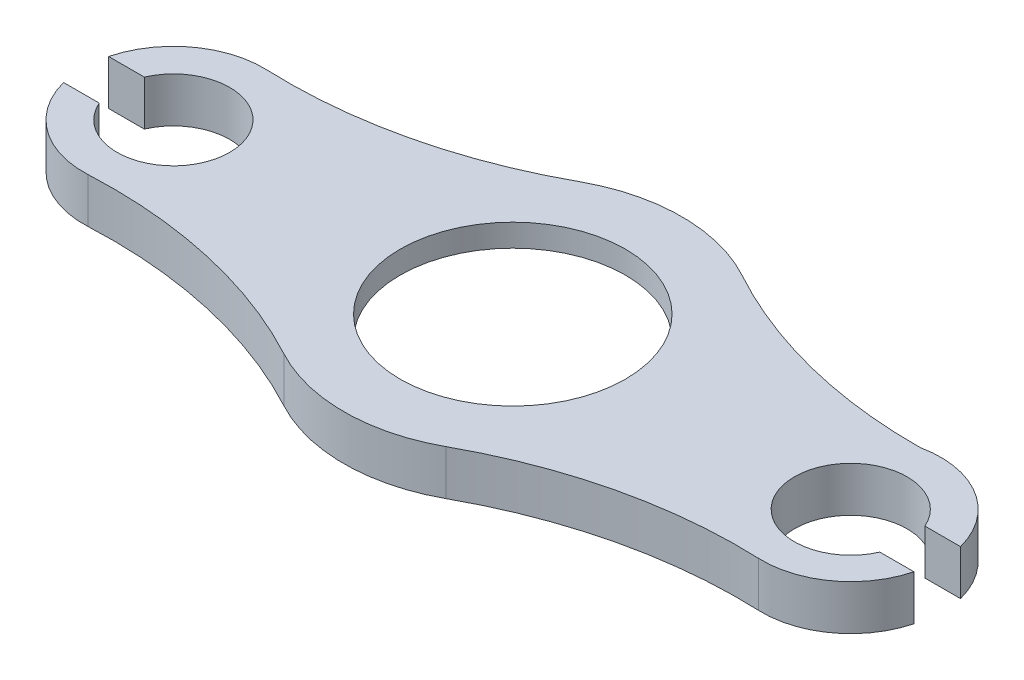
ISO-10303-21;
HEADER;
FILE_DESCRIPTION(('STEP AP214'),'2;1');
FILE_NAME('part.step','',(''),(''),'','','');
FILE_SCHEMA(('AUTOMOTIVE_DESIGN { 1 0 10303 214 1 1 1 1 }'));
ENDSEC;
DATA;
#1=APPLICATION_CONTEXT('core data for automotive mechanical design processes');
#2=APPLICATION_PROTOCOL_DEFINITION('international standard','automotive_design',2000,#1);
#3=PRODUCT_CONTEXT('',#1,'mechanical');
#4=PRODUCT('Part','Part','',(#3));
#5=PRODUCT_RELATED_PRODUCT_CATEGORY('part','',(#4));
#6=PRODUCT_DEFINITION_FORMATION('','',#4);
#7=PRODUCT_DEFINITION_CONTEXT('part definition',#1,'design');
#8=PRODUCT_DEFINITION('design','',#6,#7);
#9=PRODUCT_DEFINITION_SHAPE('','',#8);
#10=(LENGTH_UNIT() NAMED_UNIT(*) SI_UNIT(.MILLI.,.METRE.));
#11=(NAMED_UNIT(*) PLANE_ANGLE_UNIT() SI_UNIT($,.RADIAN.));
#12=(NAMED_UNIT(*) SI_UNIT($,.STERADIAN.) SOLID_ANGLE_UNIT());
#13=UNCERTAINTY_MEASURE_WITH_UNIT(LENGTH_MEASURE(1.E-05),#10,'distance_accuracy_value','');
#14=(GEOMETRIC_REPRESENTATION_CONTEXT(3) GLOBAL_UNCERTAINTY_ASSIGNED_CONTEXT((#13)) GLOBAL_UNIT_ASSIGNED_CONTEXT((#10,
#11,#12)) REPRESENTATION_CONTEXT('',''));
#15=CARTESIAN_POINT('',(0.,0.,0.));
#16=DIRECTION('',(0.,0.,1.));
#17=DIRECTION('',(1.,0.,0.));
#18=AXIS2_PLACEMENT_3D('',#15,#16,#17);
#19=CARTESIAN_POINT('',(-149.998578368596,0.,0.653060028102656));
#20=DIRECTION('',(0.,1.,0.));
#21=DIRECTION('',(0.,0.,1.));
#22=AXIS2_PLACEMENT_3D('',#19,#20,#21);
#23=PLANE('',#22);
#24=CARTESIAN_POINT('',(-149.998578368596,0.,0.653060028102656));
#25=DIRECTION('',(0.,-1.,0.));
#26=DIRECTION('',(0.,0.,1.));
#27=AXIS2_PLACEMENT_3D('',#24,#25,#26);
#28=CIRCLE('',#27,25.);
#29=CARTESIAN_POINT('',(-172.911456843375,0.,-9.34693997189736));
#30=VERTEX_POINT('',#29);
#31=CARTESIAN_POINT('',(-172.911456843375,0.,10.6530600281027));
#32=VERTEX_POINT('',#31);
#33=EDGE_CURVE('E183',#30,#32,#28,.T.);
#34=ORIENTED_EDGE('',*,*,#33,.F.);
#35=DIRECTION('',(1.,0.,0.));
#36=VECTOR('',#35,1.);
#37=CARTESIAN_POINT('',(-172.911456843375,0.,-9.34693997189736));
#38=LINE('',#37,#36);
#39=CARTESIAN_POINT('',(-188.72841183067,0.,-9.34693997189736));
#40=VERTEX_POINT('',#39);
#41=EDGE_CURVE('E113',#40,#30,#38,.T.);
#42=ORIENTED_EDGE('',*,*,#41,.F.);
#43=CARTESIAN_POINT('',(-149.998578368596,0.,0.653060028102656));
#44=DIRECTION('',(0.,1.,0.));
#45=DIRECTION('',(0.,0.,1.));
#46=AXIS2_PLACEMENT_3D('',#43,#44,#45);
#47=CIRCLE('',#46,40.);
#48=CARTESIAN_POINT('',(-148.370630479237,0.,-39.3137985633545));
#49=VERTEX_POINT('',#48);
#50=EDGE_CURVE('E107',#49,#40,#47,.T.);
#51=ORIENTED_EDGE('',*,*,#50,.F.);
#52=CARTESIAN_POINT('',(-139.63074453501,0.,-253.88196006399));
#53=DIRECTION('',(0.,-1.,0.));
#54=DIRECTION('',(0.,0.,-1.));
#55=AXIS2_PLACEMENT_3D('',#52,#53,#54);
#56=CIRCLE('',#55,214.746086195024);
#57=CARTESIAN_POINT('',(-36.1430450283182,0.,-65.716666805925));
#58=VERTEX_POINT('',#57);
#59=EDGE_CURVE('E173',#58,#49,#56,.T.);
#60=ORIENTED_EDGE('',*,*,#59,.F.);
#61=CARTESIAN_POINT('',(0.,0.,0.));
#62=DIRECTION('',(0.,1.,0.));
#63=DIRECTION('',(0.,0.,1.));
#64=AXIS2_PLACEMENT_3D('',#61,#62,#63);
#65=CIRCLE('',#64,75.);
#66=CARTESIAN_POINT('',(36.1430450283182,0.,-65.716666805925));
#67=VERTEX_POINT('',#66);
#68=EDGE_CURVE('E209',#67,#58,#65,.T.);
#69=ORIENTED_EDGE('',*,*,#68,.F.);
#70=CARTESIAN_POINT('',(139.63074453501,0.,-253.88196006399));
#71=DIRECTION('',(0.,-1.,0.));
#72=DIRECTION('',(0.,0.,1.));
#73=AXIS2_PLACEMENT_3D('',#70,#71,#72);
#74=CIRCLE('',#73,214.746086195024);
#75=CARTESIAN_POINT('',(141.781724319775,0.,-39.1466466615446));
#76=VERTEX_POINT('',#75);
#77=EDGE_CURVE('E207',#76,#67,#74,.T.);
#78=ORIENTED_EDGE('',*,*,#77,.F.);
#79=CARTESIAN_POINT('',(150.,0.,0.));
#80=DIRECTION('',(0.,1.,0.));
#81=DIRECTION('',(0.,0.,-1.));
#82=AXIS2_PLACEMENT_3D('',#79,#80,#81);
#83=CIRCLE('',#82,40.);
#84=CARTESIAN_POINT('',(188.729833462074,0.,-10.));
#85=VERTEX_POINT('',#84);
#86=EDGE_CURVE('E205',#85,#76,#83,.T.);
#87=ORIENTED_EDGE('',*,*,#86,.F.);
#88=DIRECTION('',(1.,0.,0.));
#89=VECTOR('',#88,1.);
#90=CARTESIAN_POINT('',(172.912878474779,0.,-10.));
#91=LINE('',#90,#89);
#92=CARTESIAN_POINT('',(172.912878474779,0.,-10.));
#93=VERTEX_POINT('',#92);
#94=EDGE_CURVE('E203',#93,#85,#91,.T.);
#95=ORIENTED_EDGE('',*,*,#94,.F.);
#96=CARTESIAN_POINT('',(150.,0.,0.));
#97=DIRECTION('',(0.,-1.,0.));
#98=DIRECTION('',(0.,0.,-1.));
#99=AXIS2_PLACEMENT_3D('',#96,#97,#98);
#100=CIRCLE('',#99,25.);
#101=CARTESIAN_POINT('',(172.912878474779,0.,10.));
#102=VERTEX_POINT('',#101);
#103=EDGE_CURVE('E201',#102,#93,#100,.T.);
#104=ORIENTED_EDGE('',*,*,#103,.F.);
#105=DIRECTION('',(-1.,0.,0.));
#106=VECTOR('',#105,1.);
#107=CARTESIAN_POINT('',(188.071249851903,0.,10.));
#108=LINE('',#107,#106);
#109=CARTESIAN_POINT('',(188.071249851903,0.,10.));
#110=VERTEX_POINT('',#109);
#111=EDGE_CURVE('E199',#110,#102,#108,.T.);
#112=ORIENTED_EDGE('',*,*,#111,.F.);
#113=CARTESIAN_POINT('',(150.,0.,0.));
#114=DIRECTION('',(0.,1.,0.));
#115=DIRECTION('',(0.,0.,-1.));
#116=AXIS2_PLACEMENT_3D('',#113,#114,#115);
#117=CIRCLE('',#116,39.3626735027746);
#118=CARTESIAN_POINT('',(148.389781211475,0.,39.3297249003742));
#119=VERTEX_POINT('',#118);
#120=EDGE_CURVE('E197',#119,#110,#117,.T.);
#121=ORIENTED_EDGE('',*,*,#120,.F.);
#122=CARTESIAN_POINT('',(139.605109033936,0.,253.896057466353));
#123=DIRECTION('',(0.,-1.,0.));
#124=DIRECTION('',(0.,0.,-1.));
#125=AXIS2_PLACEMENT_3D('',#122,#123,#124);
#126=CIRCLE('',#125,214.746086195024);
#127=CARTESIAN_POINT('',(36.1364093473818,0.,65.7203158808481));
#128=VERTEX_POINT('',#127);
#129=EDGE_CURVE('E195',#128,#119,#126,.T.);
#130=ORIENTED_EDGE('',*,*,#129,.F.);
#131=CARTESIAN_POINT('',(0.,0.,0.));
#132=DIRECTION('',(0.,1.,0.));
#133=DIRECTION('',(0.,0.,1.));
#134=AXIS2_PLACEMENT_3D('',#131,#132,#133);
#135=CIRCLE('',#134,75.0000000000001);
#136=CARTESIAN_POINT('',(-35.5694545588139,0.,66.0288868783087));
#137=VERTEX_POINT('',#136);
#138=EDGE_CURVE('E193',#137,#128,#135,.T.);
#139=ORIENTED_EDGE('',*,*,#138,.F.);
#140=CARTESIAN_POINT('',(-137.414803286775,0.,255.088153984052));
#141=DIRECTION('',(0.,-1.,0.));
#142=DIRECTION('',(0.,0.,1.));
#143=AXIS2_PLACEMENT_3D('',#140,#141,#142);
#144=CIRCLE('',#143,214.746086195024);
#145=CARTESIAN_POINT('',(-148.022685389076,0.,40.6042283080602));
#146=VERTEX_POINT('',#145);
#147=EDGE_CURVE('E191',#146,#137,#144,.T.);
#148=ORIENTED_EDGE('',*,*,#147,.F.);
#149=CARTESIAN_POINT('',(-149.998578368596,0.,0.653060028102656));
#150=DIRECTION('',(0.,1.,0.));
#151=DIRECTION('',(0.,0.,1.));
#152=AXIS2_PLACEMENT_3D('',#149,#150,#151);
#153=CIRCLE('',#152,40.);
#154=CARTESIAN_POINT('',(-188.72841183067,0.,10.6530600281027));
#155=VERTEX_POINT('',#154);
#156=EDGE_CURVE('E189',#155,#146,#153,.T.);
#157=ORIENTED_EDGE('',*,*,#156,.F.);
#158=DIRECTION('',(-1.,0.,0.));
#159=VECTOR('',#158,1.);
#160=CARTESIAN_POINT('',(-188.72841183067,0.,10.6530600281027));
#161=LINE('',#160,#159);
#162=EDGE_CURVE('E186',#32,#155,#161,.T.);
#163=ORIENTED_EDGE('',*,*,#162,.F.);
#164=EDGE_LOOP('',(#34,#42,#51,#60,#69,#78,#87,#95,#104,#112,#121,#130,#139,#148,#157,#163));
#165=FACE_BOUND('',#164,.T.);
#166=CARTESIAN_POINT('',(0.,0.,0.));
#167=DIRECTION('',(0.,1.,0.));
#168=DIRECTION('',(0.,0.,1.));
#169=AXIS2_PLACEMENT_3D('',#166,#167,#168);
#170=CIRCLE('',#169,67.8);
#171=CARTESIAN_POINT('',(0.,0.,67.8));
#172=VERTEX_POINT('',#171);
#173=EDGE_CURVE('E335',#172,#172,#170,.T.);
#174=ORIENTED_EDGE('',*,*,#173,.T.);
#175=EDGE_LOOP('',(#174));
#176=FACE_BOUND('',#175,.T.);
#177=ADVANCED_FACE('F37',(#165,#176),#23,.F.);
#178=CARTESIAN_POINT('',(-149.998578368596,20.,0.653060028102656));
#179=DIRECTION('',(0.,1.,0.));
#180=DIRECTION('',(0.,0.,1.));
#181=AXIS2_PLACEMENT_3D('',#178,#179,#180);
#182=PLANE('',#181);
#183=CARTESIAN_POINT('',(-149.998578368596,20.,0.653060028102656));
#184=DIRECTION('',(0.,-1.,0.));
#185=DIRECTION('',(0.,0.,1.));
#186=AXIS2_PLACEMENT_3D('',#183,#184,#185);
#187=CIRCLE('',#186,25.);
#188=CARTESIAN_POINT('',(-172.911456843375,20.,-9.34693997189736));
#189=VERTEX_POINT('',#188);
#190=CARTESIAN_POINT('',(-172.911456843375,20.,10.6530600281027));
#191=VERTEX_POINT('',#190);
#192=EDGE_CURVE('E214',#189,#191,#187,.T.);
#193=ORIENTED_EDGE('',*,*,#192,.T.);
#194=DIRECTION('',(-1.,0.,0.));
#195=VECTOR('',#194,1.);
#196=CARTESIAN_POINT('',(-188.72841183067,20.,10.6530600281027));
#197=LINE('',#196,#195);
#198=CARTESIAN_POINT('',(-188.72841183067,20.,10.6530600281027));
#199=VERTEX_POINT('',#198);
#200=EDGE_CURVE('E121',#191,#199,#197,.T.);
#201=ORIENTED_EDGE('',*,*,#200,.T.);
#202=CARTESIAN_POINT('',(-149.998578368596,20.,0.653060028102656));
#203=DIRECTION('',(0.,1.,0.));
#204=DIRECTION('',(0.,0.,1.));
#205=AXIS2_PLACEMENT_3D('',#202,#203,#204);
#206=CIRCLE('',#205,40.);
#207=CARTESIAN_POINT('',(-148.022685389076,20.,40.6042283080602));
#208=VERTEX_POINT('',#207);
#209=EDGE_CURVE('E253',#199,#208,#206,.T.);
#210=ORIENTED_EDGE('',*,*,#209,.T.);
#211=CARTESIAN_POINT('',(-137.414803286775,20.,255.088153984052));
#212=DIRECTION('',(0.,-1.,0.));
#213=DIRECTION('',(0.,0.,1.));
#214=AXIS2_PLACEMENT_3D('',#211,#212,#213);
#215=CIRCLE('',#214,214.746086195024);
#216=CARTESIAN_POINT('',(-35.5694545588139,20.,66.0288868783087));
#217=VERTEX_POINT('',#216);
#218=EDGE_CURVE('E271',#208,#217,#215,.T.);
#219=ORIENTED_EDGE('',*,*,#218,.T.);
#220=CARTESIAN_POINT('',(0.,20.,0.));
#221=DIRECTION('',(0.,1.,0.));
#222=DIRECTION('',(0.,0.,1.));
#223=AXIS2_PLACEMENT_3D('',#220,#221,#222);
#224=CIRCLE('',#223,75.0000000000001);
#225=CARTESIAN_POINT('',(36.1364093473818,20.,65.7203158808481));
#226=VERTEX_POINT('',#225);
#227=EDGE_CURVE('E268',#217,#226,#224,.T.);
#228=ORIENTED_EDGE('',*,*,#227,.T.);
#229=CARTESIAN_POINT('',(139.605109033936,20.,253.896057466353));
#230=DIRECTION('',(0.,-1.,0.));
#231=DIRECTION('',(0.,0.,-1.));
#232=AXIS2_PLACEMENT_3D('',#229,#230,#231);
#233=CIRCLE('',#232,214.746086195024);
#234=CARTESIAN_POINT('',(148.389781211475,20.,39.3297249003742));
#235=VERTEX_POINT('',#234);
#236=EDGE_CURVE('E270',#226,#235,#233,.T.);
#237=ORIENTED_EDGE('',*,*,#236,.T.);
#238=CARTESIAN_POINT('',(150.,20.,0.));
#239=DIRECTION('',(0.,1.,0.));
#240=DIRECTION('',(0.,0.,-1.));
#241=AXIS2_PLACEMENT_3D('',#238,#239,#240);
#242=CIRCLE('',#241,39.3626735027746);
#243=CARTESIAN_POINT('',(188.071249851903,20.,10.));
#244=VERTEX_POINT('',#243);
#245=EDGE_CURVE('E273',#235,#244,#242,.T.);
#246=ORIENTED_EDGE('',*,*,#245,.T.);
#247=DIRECTION('',(-1.,0.,0.));
#248=VECTOR('',#247,1.);
#249=CARTESIAN_POINT('',(188.071249851903,20.,10.));
#250=LINE('',#249,#248);
#251=CARTESIAN_POINT('',(172.912878474779,20.,10.));
#252=VERTEX_POINT('',#251);
#253=EDGE_CURVE('E279',#244,#252,#250,.T.);
#254=ORIENTED_EDGE('',*,*,#253,.T.);
#255=CARTESIAN_POINT('',(150.,20.,0.));
#256=DIRECTION('',(0.,-1.,0.));
#257=DIRECTION('',(0.,0.,-1.));
#258=AXIS2_PLACEMENT_3D('',#255,#256,#257);
#259=CIRCLE('',#258,25.);
#260=CARTESIAN_POINT('',(172.912878474779,20.,-10.));
#261=VERTEX_POINT('',#260);
#262=EDGE_CURVE('E281',#252,#261,#259,.T.);
#263=ORIENTED_EDGE('',*,*,#262,.T.);
#264=DIRECTION('',(1.,0.,0.));
#265=VECTOR('',#264,1.);
#266=CARTESIAN_POINT('',(172.912878474779,20.,-10.));
#267=LINE('',#266,#265);
#268=CARTESIAN_POINT('',(188.729833462074,20.,-10.));
#269=VERTEX_POINT('',#268);
#270=EDGE_CURVE('E283',#261,#269,#267,.T.);
#271=ORIENTED_EDGE('',*,*,#270,.T.);
#272=CARTESIAN_POINT('',(150.,20.,0.));
#273=DIRECTION('',(0.,1.,0.));
#274=DIRECTION('',(0.,0.,-1.));
#275=AXIS2_PLACEMENT_3D('',#272,#273,#274);
#276=CIRCLE('',#275,40.);
#277=CARTESIAN_POINT('',(141.781724319775,20.,-39.1466466615446));
#278=VERTEX_POINT('',#277);
#279=EDGE_CURVE('E285',#269,#278,#276,.T.);
#280=ORIENTED_EDGE('',*,*,#279,.T.);
#281=CARTESIAN_POINT('',(139.63074453501,20.,-253.88196006399));
#282=DIRECTION('',(0.,-1.,0.));
#283=DIRECTION('',(0.,0.,1.));
#284=AXIS2_PLACEMENT_3D('',#281,#282,#283);
#285=CIRCLE('',#284,214.746086195024);
#286=CARTESIAN_POINT('',(36.1430450283182,20.,-65.716666805925));
#287=VERTEX_POINT('',#286);
#288=EDGE_CURVE('E287',#278,#287,#285,.T.);
#289=ORIENTED_EDGE('',*,*,#288,.T.);
#290=CARTESIAN_POINT('',(0.,20.,0.));
#291=DIRECTION('',(0.,1.,0.));
#292=DIRECTION('',(0.,0.,1.));
#293=AXIS2_PLACEMENT_3D('',#290,#291,#292);
#294=CIRCLE('',#293,75.);
#295=CARTESIAN_POINT('',(-36.1430450283182,20.,-65.716666805925));
#296=VERTEX_POINT('',#295);
#297=EDGE_CURVE('E165',#287,#296,#294,.T.);
#298=ORIENTED_EDGE('',*,*,#297,.T.);
#299=CARTESIAN_POINT('',(-139.63074453501,20.,-253.88196006399));
#300=DIRECTION('',(0.,-1.,0.));
#301=DIRECTION('',(0.,0.,-1.));
#302=AXIS2_PLACEMENT_3D('',#299,#300,#301);
#303=CIRCLE('',#302,214.746086195024);
#304=CARTESIAN_POINT('',(-148.370630479237,20.,-39.3137985633545));
#305=VERTEX_POINT('',#304);
#306=EDGE_CURVE('E158',#296,#305,#303,.T.);
#307=ORIENTED_EDGE('',*,*,#306,.T.);
#308=CARTESIAN_POINT('',(-149.998578368596,20.,0.653060028102656));
#309=DIRECTION('',(0.,1.,0.));
#310=DIRECTION('',(0.,0.,1.));
#311=AXIS2_PLACEMENT_3D('',#308,#309,#310);
#312=CIRCLE('',#311,40.);
#313=CARTESIAN_POINT('',(-188.72841183067,20.,-9.34693997189736));
#314=VERTEX_POINT('',#313);
#315=EDGE_CURVE('E163',#305,#314,#312,.T.);
#316=ORIENTED_EDGE('',*,*,#315,.T.);
#317=DIRECTION('',(1.,0.,0.));
#318=VECTOR('',#317,1.);
#319=CARTESIAN_POINT('',(-172.911456843375,20.,-9.34693997189736));
#320=LINE('',#319,#318);
#321=EDGE_CURVE('E54',#314,#189,#320,.T.);
#322=ORIENTED_EDGE('',*,*,#321,.T.);
#323=EDGE_LOOP('',(#193,#201,#210,#219,#228,#237,#246,#254,#263,#271,#280,#289,#298,#307,#316,#322));
#324=FACE_BOUND('',#323,.T.);
#325=CARTESIAN_POINT('',(0.,20.,0.));
#326=DIRECTION('',(0.,1.,0.));
#327=DIRECTION('',(0.,0.,1.));
#328=AXIS2_PLACEMENT_3D('',#325,#326,#327);
#329=CIRCLE('',#328,50.);
#330=CARTESIAN_POINT('',(0.,20.,50.));
#331=VERTEX_POINT('',#330);
#332=EDGE_CURVE('E187',#331,#331,#329,.T.);
#333=ORIENTED_EDGE('',*,*,#332,.F.);
#334=EDGE_LOOP('',(#333));
#335=FACE_BOUND('',#334,.T.);
#336=ADVANCED_FACE('F160',(#324,#335),#182,.T.);
#337=CARTESIAN_POINT('',(-149.998578368596,20.,0.653060028102656));
#338=DIRECTION('',(0.,-1.,0.));
#339=DIRECTION('',(0.,0.,-1.));
#340=AXIS2_PLACEMENT_3D('',#337,#338,#339);
#341=CYLINDRICAL_SURFACE('',#340,25.);
#342=ORIENTED_EDGE('',*,*,#33,.T.);
#343=DIRECTION('',(0.,-1.,0.));
#344=VECTOR('',#343,1.);
#345=CARTESIAN_POINT('',(-172.911456843375,20.,10.6530600281027));
#346=LINE('',#345,#344);
#347=EDGE_CURVE('E11',#191,#32,#346,.T.);
#348=ORIENTED_EDGE('',*,*,#347,.F.);
#349=ORIENTED_EDGE('',*,*,#192,.F.);
#350=DIRECTION('',(0.,-1.,0.));
#351=VECTOR('',#350,1.);
#352=CARTESIAN_POINT('',(-172.911456843375,20.,-9.34693997189736));
#353=LINE('',#352,#351);
#354=EDGE_CURVE('E179',#189,#30,#353,.T.);
#355=ORIENTED_EDGE('',*,*,#354,.T.);
#356=EDGE_LOOP('',(#342,#348,#349,#355));
#357=FACE_BOUND('',#356,.T.);
#358=ADVANCED_FACE('F39',(#357),#341,.F.);
#359=CARTESIAN_POINT('',(-188.72841183067,20.,10.6530600281027));
#360=DIRECTION('',(0.,0.,1.));
#361=DIRECTION('',(1.,0.,0.));
#362=AXIS2_PLACEMENT_3D('',#359,#360,#361);
#363=PLANE('',#362);
#364=ORIENTED_EDGE('',*,*,#162,.T.);
#365=DIRECTION('',(0.,-1.,0.));
#366=VECTOR('',#365,1.);
#367=CARTESIAN_POINT('',(-188.72841183067,20.,10.6530600281027));
#368=LINE('',#367,#366);
#369=EDGE_CURVE('E46',#199,#155,#368,.T.);
#370=ORIENTED_EDGE('',*,*,#369,.F.);
#371=ORIENTED_EDGE('',*,*,#200,.F.);
#372=ORIENTED_EDGE('',*,*,#347,.T.);
#373=EDGE_LOOP('',(#364,#370,#371,#372));
#374=FACE_BOUND('',#373,.T.);
#375=ADVANCED_FACE('F506',(#374),#363,.F.);
#376=CARTESIAN_POINT('',(-149.998578368596,20.,0.653060028102656));
#377=DIRECTION('',(0.,-1.,0.));
#378=DIRECTION('',(0.,0.,-1.));
#379=AXIS2_PLACEMENT_3D('',#376,#377,#378);
#380=CYLINDRICAL_SURFACE('',#379,40.);
#381=ORIENTED_EDGE('',*,*,#156,.T.);
#382=DIRECTION('',(0.,-1.,0.));
#383=VECTOR('',#382,1.);
#384=CARTESIAN_POINT('',(-148.022685389076,20.,40.6042283080602));
#385=LINE('',#384,#383);
#386=EDGE_CURVE('E245',#208,#146,#385,.T.);
#387=ORIENTED_EDGE('',*,*,#386,.F.);
#388=ORIENTED_EDGE('',*,*,#209,.F.);
#389=ORIENTED_EDGE('',*,*,#369,.T.);
#390=EDGE_LOOP('',(#381,#387,#388,#389));
#391=FACE_BOUND('',#390,.T.);
#392=ADVANCED_FACE('F251',(#391),#380,.T.);
#393=CARTESIAN_POINT('',(-137.414803286775,20.,255.088153984052));
#394=DIRECTION('',(0.,-1.,0.));
#395=DIRECTION('',(0.,0.,-1.));
#396=AXIS2_PLACEMENT_3D('',#393,#394,#395);
#397=CYLINDRICAL_SURFACE('',#396,214.746086195024);
#398=ORIENTED_EDGE('',*,*,#147,.T.);
#399=DIRECTION('',(0.,-1.,0.));
#400=VECTOR('',#399,1.);
#401=CARTESIAN_POINT('',(-35.5694545588139,20.,66.0288868783087));
#402=LINE('',#401,#400);
#403=EDGE_CURVE('E242',#217,#137,#402,.T.);
#404=ORIENTED_EDGE('',*,*,#403,.F.);
#405=ORIENTED_EDGE('',*,*,#218,.F.);
#406=ORIENTED_EDGE('',*,*,#386,.T.);
#407=EDGE_LOOP('',(#398,#404,#405,#406));
#408=FACE_BOUND('',#407,.T.);
#409=ADVANCED_FACE('F262',(#408),#397,.F.);
#410=CARTESIAN_POINT('',(0.,20.,0.));
#411=DIRECTION('',(0.,-1.,0.));
#412=DIRECTION('',(0.,0.,-1.));
#413=AXIS2_PLACEMENT_3D('',#410,#411,#412);
#414=CYLINDRICAL_SURFACE('',#413,75.0000000000001);
#415=ORIENTED_EDGE('',*,*,#138,.T.);
#416=DIRECTION('',(0.,-1.,0.));
#417=VECTOR('',#416,1.);
#418=CARTESIAN_POINT('',(36.1364093473818,20.,65.7203158808481));
#419=LINE('',#418,#417);
#420=EDGE_CURVE('E239',#226,#128,#419,.T.);
#421=ORIENTED_EDGE('',*,*,#420,.F.);
#422=ORIENTED_EDGE('',*,*,#227,.F.);
#423=ORIENTED_EDGE('',*,*,#403,.T.);
#424=EDGE_LOOP('',(#415,#421,#422,#423));
#425=FACE_BOUND('',#424,.T.);
#426=ADVANCED_FACE('F266',(#425),#414,.T.);
#427=CARTESIAN_POINT('',(139.605109033936,20.,253.896057466353));
#428=DIRECTION('',(0.,-1.,0.));
#429=DIRECTION('',(0.,0.,-1.));
#430=AXIS2_PLACEMENT_3D('',#427,#428,#429);
#431=CYLINDRICAL_SURFACE('',#430,214.746086195024);
#432=ORIENTED_EDGE('',*,*,#129,.T.);
#433=DIRECTION('',(0.,-1.,0.));
#434=VECTOR('',#433,1.);
#435=CARTESIAN_POINT('',(148.389781211475,20.,39.3297249003742));
#436=LINE('',#435,#434);
#437=EDGE_CURVE('E236',#235,#119,#436,.T.);
#438=ORIENTED_EDGE('',*,*,#437,.F.);
#439=ORIENTED_EDGE('',*,*,#236,.F.);
#440=ORIENTED_EDGE('',*,*,#420,.T.);
#441=EDGE_LOOP('',(#432,#438,#439,#440));
#442=FACE_BOUND('',#441,.T.);
#443=ADVANCED_FACE('F467',(#442),#431,.F.);
#444=CARTESIAN_POINT('',(150.,20.,0.));
#445=DIRECTION('',(0.,-1.,0.));
#446=DIRECTION('',(0.,0.,-1.));
#447=AXIS2_PLACEMENT_3D('',#444,#445,#446);
#448=CYLINDRICAL_SURFACE('',#447,39.3626735027746);
#449=ORIENTED_EDGE('',*,*,#120,.T.);
#450=DIRECTION('',(0.,-1.,0.));
#451=VECTOR('',#450,1.);
#452=CARTESIAN_POINT('',(188.071249851903,20.,10.));
#453=LINE('',#452,#451);
#454=EDGE_CURVE('E233',#244,#110,#453,.T.);
#455=ORIENTED_EDGE('',*,*,#454,.F.);
#456=ORIENTED_EDGE('',*,*,#245,.F.);
#457=ORIENTED_EDGE('',*,*,#437,.T.);
#458=EDGE_LOOP('',(#449,#455,#456,#457));
#459=FACE_BOUND('',#458,.T.);
#460=ADVANCED_FACE('F456',(#459),#448,.T.);
#461=CARTESIAN_POINT('',(188.071249851903,20.,10.));
#462=DIRECTION('',(0.,0.,1.));
#463=DIRECTION('',(1.,0.,0.));
#464=AXIS2_PLACEMENT_3D('',#461,#462,#463);
#465=PLANE('',#464);
#466=ORIENTED_EDGE('',*,*,#111,.T.);
#467=DIRECTION('',(0.,-1.,0.));
#468=VECTOR('',#467,1.);
#469=CARTESIAN_POINT('',(172.912878474779,20.,10.));
#470=LINE('',#469,#468);
#471=EDGE_CURVE('E230',#252,#102,#470,.T.);
#472=ORIENTED_EDGE('',*,*,#471,.F.);
#473=ORIENTED_EDGE('',*,*,#253,.F.);
#474=ORIENTED_EDGE('',*,*,#454,.T.);
#475=EDGE_LOOP('',(#466,#472,#473,#474));
#476=FACE_BOUND('',#475,.T.);
#477=ADVANCED_FACE('F445',(#476),#465,.F.);
#478=CARTESIAN_POINT('',(150.,20.,0.));
#479=DIRECTION('',(0.,-1.,0.));
#480=DIRECTION('',(0.,0.,-1.));
#481=AXIS2_PLACEMENT_3D('',#478,#479,#480);
#482=CYLINDRICAL_SURFACE('',#481,25.);
#483=ORIENTED_EDGE('',*,*,#103,.T.);
#484=DIRECTION('',(0.,-1.,0.));
#485=VECTOR('',#484,1.);
#486=CARTESIAN_POINT('',(172.912878474779,20.,-10.));
#487=LINE('',#486,#485);
#488=EDGE_CURVE('E227',#261,#93,#487,.T.);
#489=ORIENTED_EDGE('',*,*,#488,.F.);
#490=ORIENTED_EDGE('',*,*,#262,.F.);
#491=ORIENTED_EDGE('',*,*,#471,.T.);
#492=EDGE_LOOP('',(#483,#489,#490,#491));
#493=FACE_BOUND('',#492,.T.);
#494=ADVANCED_FACE('F434',(#493),#482,.F.);
#495=CARTESIAN_POINT('',(172.912878474779,20.,-10.));
#496=DIRECTION('',(0.,0.,-1.));
#497=DIRECTION('',(-1.,0.,0.));
#498=AXIS2_PLACEMENT_3D('',#495,#496,#497);
#499=PLANE('',#498);
#500=ORIENTED_EDGE('',*,*,#94,.T.);
#501=DIRECTION('',(0.,-1.,0.));
#502=VECTOR('',#501,1.);
#503=CARTESIAN_POINT('',(188.729833462074,20.,-10.));
#504=LINE('',#503,#502);
#505=EDGE_CURVE('E224',#269,#85,#504,.T.);
#506=ORIENTED_EDGE('',*,*,#505,.F.);
#507=ORIENTED_EDGE('',*,*,#270,.F.);
#508=ORIENTED_EDGE('',*,*,#488,.T.);
#509=EDGE_LOOP('',(#500,#506,#507,#508));
#510=FACE_BOUND('',#509,.T.);
#511=ADVANCED_FACE('F423',(#510),#499,.F.);
#512=CARTESIAN_POINT('',(150.,20.,0.));
#513=DIRECTION('',(0.,-1.,0.));
#514=DIRECTION('',(0.,0.,-1.));
#515=AXIS2_PLACEMENT_3D('',#512,#513,#514);
#516=CYLINDRICAL_SURFACE('',#515,40.);
#517=ORIENTED_EDGE('',*,*,#86,.T.);
#518=DIRECTION('',(0.,-1.,0.));
#519=VECTOR('',#518,1.);
#520=CARTESIAN_POINT('',(141.781724319775,20.,-39.1466466615446));
#521=LINE('',#520,#519);
#522=EDGE_CURVE('E221',#278,#76,#521,.T.);
#523=ORIENTED_EDGE('',*,*,#522,.F.);
#524=ORIENTED_EDGE('',*,*,#279,.F.);
#525=ORIENTED_EDGE('',*,*,#505,.T.);
#526=EDGE_LOOP('',(#517,#523,#524,#525));
#527=FACE_BOUND('',#526,.T.);
#528=ADVANCED_FACE('F413',(#527),#516,.T.);
#529=CARTESIAN_POINT('',(139.63074453501,20.,-253.88196006399));
#530=DIRECTION('',(0.,-1.,0.));
#531=DIRECTION('',(0.,0.,-1.));
#532=AXIS2_PLACEMENT_3D('',#529,#530,#531);
#533=CYLINDRICAL_SURFACE('',#532,214.746086195024);
#534=ORIENTED_EDGE('',*,*,#77,.T.);
#535=DIRECTION('',(0.,-1.,0.));
#536=VECTOR('',#535,1.);
#537=CARTESIAN_POINT('',(36.1430450283182,20.,-65.716666805925));
#538=LINE('',#537,#536);
#539=EDGE_CURVE('E218',#287,#67,#538,.T.);
#540=ORIENTED_EDGE('',*,*,#539,.F.);
#541=ORIENTED_EDGE('',*,*,#288,.F.);
#542=ORIENTED_EDGE('',*,*,#522,.T.);
#543=EDGE_LOOP('',(#534,#540,#541,#542));
#544=FACE_BOUND('',#543,.T.);
#545=ADVANCED_FACE('F293',(#544),#533,.F.);
#546=CARTESIAN_POINT('',(0.,20.,0.));
#547=DIRECTION('',(0.,-1.,0.));
#548=DIRECTION('',(0.,0.,-1.));
#549=AXIS2_PLACEMENT_3D('',#546,#547,#548);
#550=CYLINDRICAL_SURFACE('',#549,75.);
#551=ORIENTED_EDGE('',*,*,#68,.T.);
#552=DIRECTION('',(0.,-1.,0.));
#553=VECTOR('',#552,1.);
#554=CARTESIAN_POINT('',(-36.1430450283182,20.,-65.716666805925));
#555=LINE('',#554,#553);
#556=EDGE_CURVE('E174',#296,#58,#555,.T.);
#557=ORIENTED_EDGE('',*,*,#556,.F.);
#558=ORIENTED_EDGE('',*,*,#297,.F.);
#559=ORIENTED_EDGE('',*,*,#539,.T.);
#560=EDGE_LOOP('',(#551,#557,#558,#559));
#561=FACE_BOUND('',#560,.T.);
#562=ADVANCED_FACE('F297',(#561),#550,.T.);
#563=CARTESIAN_POINT('',(-139.63074453501,20.,-253.88196006399));
#564=DIRECTION('',(0.,-1.,0.));
#565=DIRECTION('',(0.,0.,-1.));
#566=AXIS2_PLACEMENT_3D('',#563,#564,#565);
#567=CYLINDRICAL_SURFACE('',#566,214.746086195024);
#568=ORIENTED_EDGE('',*,*,#59,.T.);
#569=DIRECTION('',(0.,-1.,0.));
#570=VECTOR('',#569,1.);
#571=CARTESIAN_POINT('',(-148.370630479237,20.,-39.3137985633545));
#572=LINE('',#571,#570);
#573=EDGE_CURVE('E170',#305,#49,#572,.T.);
#574=ORIENTED_EDGE('',*,*,#573,.F.);
#575=ORIENTED_EDGE('',*,*,#306,.F.);
#576=ORIENTED_EDGE('',*,*,#556,.T.);
#577=EDGE_LOOP('',(#568,#574,#575,#576));
#578=FACE_BOUND('',#577,.T.);
#579=ADVANCED_FACE('F171',(#578),#567,.F.);
#580=CARTESIAN_POINT('',(-149.998578368596,20.,0.653060028102656));
#581=DIRECTION('',(0.,-1.,0.));
#582=DIRECTION('',(0.,0.,-1.));
#583=AXIS2_PLACEMENT_3D('',#580,#581,#582);
#584=CYLINDRICAL_SURFACE('',#583,40.);
#585=ORIENTED_EDGE('',*,*,#50,.T.);
#586=DIRECTION('',(0.,-1.,0.));
#587=VECTOR('',#586,1.);
#588=CARTESIAN_POINT('',(-188.72841183067,20.,-9.34693997189736));
#589=LINE('',#588,#587);
#590=EDGE_CURVE('E175',#314,#40,#589,.T.);
#591=ORIENTED_EDGE('',*,*,#590,.F.);
#592=ORIENTED_EDGE('',*,*,#315,.F.);
#593=ORIENTED_EDGE('',*,*,#573,.T.);
#594=EDGE_LOOP('',(#585,#591,#592,#593));
#595=FACE_BOUND('',#594,.T.);
#596=ADVANCED_FACE('F177',(#595),#584,.T.);
#597=CARTESIAN_POINT('',(-172.911456843375,20.,-9.34693997189736));
#598=DIRECTION('',(0.,0.,-1.));
#599=DIRECTION('',(-1.,0.,0.));
#600=AXIS2_PLACEMENT_3D('',#597,#598,#599);
#601=PLANE('',#600);
#602=ORIENTED_EDGE('',*,*,#41,.T.);
#603=ORIENTED_EDGE('',*,*,#354,.F.);
#604=ORIENTED_EDGE('',*,*,#321,.F.);
#605=ORIENTED_EDGE('',*,*,#590,.T.);
#606=EDGE_LOOP('',(#602,#603,#604,#605));
#607=FACE_BOUND('',#606,.T.);
#608=ADVANCED_FACE('F301',(#607),#601,.F.);
#609=CARTESIAN_POINT('',(0.,20.,0.));
#610=DIRECTION('',(0.,-1.,0.));
#611=DIRECTION('',(0.,0.,-1.));
#612=AXIS2_PLACEMENT_3D('',#609,#610,#611);
#613=CYLINDRICAL_SURFACE('',#612,50.);
#614=CARTESIAN_POINT('',(0.,10.,0.));
#615=DIRECTION('',(0.,1.,0.));
#616=DIRECTION('',(0.,0.,1.));
#617=AXIS2_PLACEMENT_3D('',#614,#615,#616);
#618=CIRCLE('',#617,50.);
#619=CARTESIAN_POINT('',(0.,10.,50.));
#620=VERTEX_POINT('',#619);
#621=EDGE_CURVE('E334',#620,#620,#618,.T.);
#622=ORIENTED_EDGE('',*,*,#621,.F.);
#623=EDGE_LOOP('',(#622));
#624=FACE_BOUND('',#623,.T.);
#625=ORIENTED_EDGE('',*,*,#332,.T.);
#626=EDGE_LOOP('',(#625));
#627=FACE_BOUND('',#626,.T.);
#628=ADVANCED_FACE('F303',(#624,#627),#613,.F.);
#629=CARTESIAN_POINT('',(0.,10.,0.));
#630=DIRECTION('',(0.,1.,0.));
#631=DIRECTION('',(0.,0.,1.));
#632=AXIS2_PLACEMENT_3D('',#629,#630,#631);
#633=PLANE('',#632);
#634=CARTESIAN_POINT('',(0.,10.,0.));
#635=DIRECTION('',(0.,1.,0.));
#636=DIRECTION('',(0.,0.,1.));
#637=AXIS2_PLACEMENT_3D('',#634,#635,#636);
#638=CIRCLE('',#637,67.8);
#639=CARTESIAN_POINT('',(0.,10.,67.8));
#640=VERTEX_POINT('',#639);
#641=EDGE_CURVE('E331',#640,#640,#638,.T.);
#642=ORIENTED_EDGE('',*,*,#641,.F.);
#643=EDGE_LOOP('',(#642));
#644=FACE_BOUND('',#643,.T.);
#645=ORIENTED_EDGE('',*,*,#621,.T.);
#646=EDGE_LOOP('',(#645));
#647=FACE_BOUND('',#646,.T.);
#648=ADVANCED_FACE('F309',(#644,#647),#633,.F.);
#649=CARTESIAN_POINT('',(0.,10.,0.));
#650=DIRECTION('',(0.,-1.,0.));
#651=DIRECTION('',(0.,0.,-1.));
#652=AXIS2_PLACEMENT_3D('',#649,#650,#651);
#653=CYLINDRICAL_SURFACE('',#652,67.8);
#654=ORIENTED_EDGE('',*,*,#641,.T.);
#655=EDGE_LOOP('',(#654));
#656=FACE_BOUND('',#655,.T.);
#657=ORIENTED_EDGE('',*,*,#173,.F.);
#658=EDGE_LOOP('',(#657));
#659=FACE_BOUND('',#658,.T.);
#660=ADVANCED_FACE('F320',(#656,#659),#653,.F.);
#661=CLOSED_SHELL('',(#177,#336,#358,#375,#392,#409,#426,#443,#460,#477,#494,#511,#528,#545,
#562,#579,#596,#608,#628,#648,#660));
#662=MANIFOLD_SOLID_BREP('B2',#661);
#663=ADVANCED_BREP_SHAPE_REPRESENTATION('',(#18,#662),#14);
#664=SHAPE_DEFINITION_REPRESENTATION(#9,#663);
ENDSEC;
END-ISO-10303-21;
